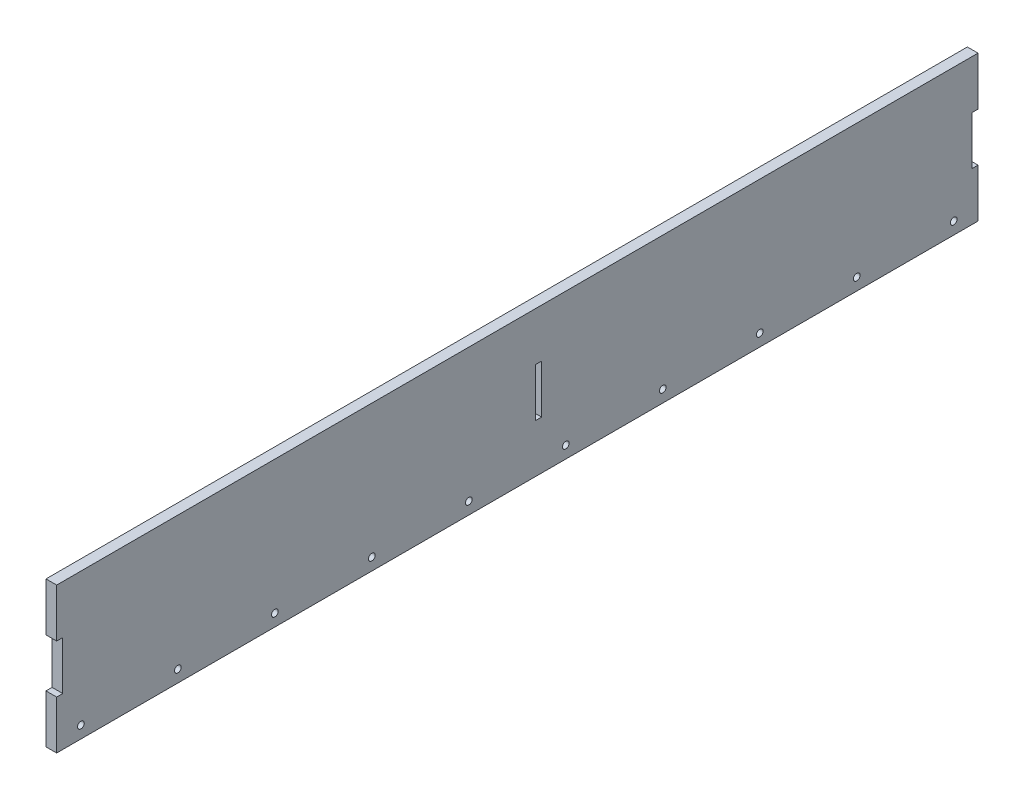
ISO-10303-21;
HEADER;
FILE_DESCRIPTION(('STEP AP214'),'2;1');
FILE_NAME('part.step','',(''),(''),'','','');
FILE_SCHEMA(('AUTOMOTIVE_DESIGN { 1 0 10303 214 1 1 1 1 }'));
ENDSEC;
DATA;
#1=APPLICATION_CONTEXT('core data for automotive mechanical design processes');
#2=APPLICATION_PROTOCOL_DEFINITION('international standard','automotive_design',2000,#1);
#3=PRODUCT_CONTEXT('',#1,'mechanical');
#4=PRODUCT('Part','Part','',(#3));
#5=PRODUCT_RELATED_PRODUCT_CATEGORY('part','',(#4));
#6=PRODUCT_DEFINITION_FORMATION('','',#4);
#7=PRODUCT_DEFINITION_CONTEXT('part definition',#1,'design');
#8=PRODUCT_DEFINITION('design','',#6,#7);
#9=PRODUCT_DEFINITION_SHAPE('','',#8);
#10=(LENGTH_UNIT() NAMED_UNIT(*) SI_UNIT(.MILLI.,.METRE.));
#11=(NAMED_UNIT(*) PLANE_ANGLE_UNIT() SI_UNIT($,.RADIAN.));
#12=(NAMED_UNIT(*) SI_UNIT($,.STERADIAN.) SOLID_ANGLE_UNIT());
#13=UNCERTAINTY_MEASURE_WITH_UNIT(LENGTH_MEASURE(1.E-05),#10,'distance_accuracy_value','');
#14=(GEOMETRIC_REPRESENTATION_CONTEXT(3) GLOBAL_UNCERTAINTY_ASSIGNED_CONTEXT((#13)) GLOBAL_UNIT_ASSIGNED_CONTEXT((#10,
#11,#12)) REPRESENTATION_CONTEXT('',''));
#15=CARTESIAN_POINT('',(0.,0.,0.));
#16=DIRECTION('',(0.,0.,1.));
#17=DIRECTION('',(1.,0.,0.));
#18=AXIS2_PLACEMENT_3D('',#15,#16,#17);
#19=CARTESIAN_POINT('',(-88.9,0.,0.));
#20=DIRECTION('',(-1.,0.,0.));
#21=DIRECTION('',(0.,0.,1.));
#22=AXIS2_PLACEMENT_3D('',#19,#20,#21);
#23=PLANE('',#22);
#24=CARTESIAN_POINT('',(-88.9,-130.175,-209.55));
#25=DIRECTION('',(-1.,0.,0.));
#26=DIRECTION('',(0.,0.,1.));
#27=AXIS2_PLACEMENT_3D('',#24,#25,#26);
#28=CIRCLE('',#27,1.7526);
#29=CARTESIAN_POINT('',(-88.9,-130.175,-207.7974));
#30=VERTEX_POINT('',#29);
#31=EDGE_CURVE('E175',#30,#30,#28,.T.);
#32=ORIENTED_EDGE('',*,*,#31,.T.);
#33=EDGE_LOOP('',(#32));
#34=FACE_BOUND('',#33,.T.);
#35=CARTESIAN_POINT('',(-88.9,-130.175,-260.35));
#36=DIRECTION('',(-1.,0.,0.));
#37=DIRECTION('',(0.,0.,1.));
#38=AXIS2_PLACEMENT_3D('',#35,#36,#37);
#39=CIRCLE('',#38,1.75260000000004);
#40=CARTESIAN_POINT('',(-88.9,-130.175,-258.5974));
#41=VERTEX_POINT('',#40);
#42=EDGE_CURVE('E299',#41,#41,#39,.T.);
#43=ORIENTED_EDGE('',*,*,#42,.T.);
#44=EDGE_LOOP('',(#43));
#45=FACE_BOUND('',#44,.T.);
#46=CARTESIAN_POINT('',(-88.9,-130.175,-311.15));
#47=DIRECTION('',(-1.,0.,0.));
#48=DIRECTION('',(0.,0.,1.));
#49=AXIS2_PLACEMENT_3D('',#46,#47,#48);
#50=CIRCLE('',#49,1.75259999999998);
#51=CARTESIAN_POINT('',(-88.9,-130.175,-309.3974));
#52=VERTEX_POINT('',#51);
#53=EDGE_CURVE('E296',#52,#52,#50,.T.);
#54=ORIENTED_EDGE('',*,*,#53,.T.);
#55=EDGE_LOOP('',(#54));
#56=FACE_BOUND('',#55,.T.);
#57=CARTESIAN_POINT('',(-88.9,-130.175,-361.95));
#58=DIRECTION('',(-1.,0.,0.));
#59=DIRECTION('',(0.,0.,1.));
#60=AXIS2_PLACEMENT_3D('',#57,#58,#59);
#61=CIRCLE('',#60,1.75259999999998);
#62=CARTESIAN_POINT('',(-88.9,-130.175,-360.1974));
#63=VERTEX_POINT('',#62);
#64=EDGE_CURVE('E293',#63,#63,#61,.T.);
#65=ORIENTED_EDGE('',*,*,#64,.T.);
#66=EDGE_LOOP('',(#65));
#67=FACE_BOUND('',#66,.T.);
#68=CARTESIAN_POINT('',(-88.9,-130.175,-412.75));
#69=DIRECTION('',(-1.,0.,0.));
#70=DIRECTION('',(0.,0.,1.));
#71=AXIS2_PLACEMENT_3D('',#68,#69,#70);
#72=CIRCLE('',#71,1.75260000000004);
#73=CARTESIAN_POINT('',(-88.9,-130.175,-410.9974));
#74=VERTEX_POINT('',#73);
#75=EDGE_CURVE('E289',#74,#74,#72,.T.);
#76=ORIENTED_EDGE('',*,*,#75,.T.);
#77=EDGE_LOOP('',(#76));
#78=FACE_BOUND('',#77,.T.);
#79=CARTESIAN_POINT('',(-88.9,-130.175,-463.55));
#80=DIRECTION('',(-1.,0.,0.));
#81=DIRECTION('',(0.,0.,1.));
#82=AXIS2_PLACEMENT_3D('',#79,#80,#81);
#83=CIRCLE('',#82,1.75259999999998);
#84=CARTESIAN_POINT('',(-88.9,-130.175,-461.7974));
#85=VERTEX_POINT('',#84);
#86=EDGE_CURVE('E285',#85,#85,#83,.T.);
#87=ORIENTED_EDGE('',*,*,#86,.T.);
#88=EDGE_LOOP('',(#87));
#89=FACE_BOUND('',#88,.T.);
#90=CARTESIAN_POINT('',(-88.9,-130.175,-514.35));
#91=DIRECTION('',(-1.,0.,0.));
#92=DIRECTION('',(0.,0.,1.));
#93=AXIS2_PLACEMENT_3D('',#90,#91,#92);
#94=CIRCLE('',#93,1.75260000000003);
#95=CARTESIAN_POINT('',(-88.9,-130.175,-512.5974));
#96=VERTEX_POINT('',#95);
#97=EDGE_CURVE('E281',#96,#96,#94,.T.);
#98=ORIENTED_EDGE('',*,*,#97,.T.);
#99=EDGE_LOOP('',(#98));
#100=FACE_BOUND('',#99,.T.);
#101=CARTESIAN_POINT('',(-88.9,-130.175,-565.15));
#102=DIRECTION('',(-1.,0.,0.));
#103=DIRECTION('',(0.,0.,1.));
#104=AXIS2_PLACEMENT_3D('',#101,#102,#103);
#105=CIRCLE('',#104,1.75260000000003);
#106=CARTESIAN_POINT('',(-88.9,-130.175,-563.3974));
#107=VERTEX_POINT('',#106);
#108=EDGE_CURVE('E277',#107,#107,#105,.T.);
#109=ORIENTED_EDGE('',*,*,#108,.T.);
#110=EDGE_LOOP('',(#109));
#111=FACE_BOUND('',#110,.T.);
#112=CARTESIAN_POINT('',(-88.9,-130.175,-615.95));
#113=DIRECTION('',(-1.,0.,0.));
#114=DIRECTION('',(0.,0.,1.));
#115=AXIS2_PLACEMENT_3D('',#112,#113,#114);
#116=CIRCLE('',#115,1.75259999999991);
#117=CARTESIAN_POINT('',(-88.9,-130.175,-614.1974));
#118=VERTEX_POINT('',#117);
#119=EDGE_CURVE('E273',#118,#118,#116,.T.);
#120=ORIENTED_EDGE('',*,*,#119,.T.);
#121=EDGE_LOOP('',(#120));
#122=FACE_BOUND('',#121,.T.);
#123=CARTESIAN_POINT('',(-88.9,-130.175,-666.75));
#124=DIRECTION('',(-1.,0.,0.));
#125=DIRECTION('',(0.,0.,1.));
#126=AXIS2_PLACEMENT_3D('',#123,#124,#125);
#127=CIRCLE('',#126,1.75260000000003);
#128=CARTESIAN_POINT('',(-88.9,-130.175,-664.9974));
#129=VERTEX_POINT('',#128);
#130=EDGE_CURVE('E269',#129,#129,#127,.T.);
#131=ORIENTED_EDGE('',*,*,#130,.T.);
#132=EDGE_LOOP('',(#131));
#133=FACE_BOUND('',#132,.T.);
#134=DIRECTION('',(0.,-1.,0.));
#135=VECTOR('',#134,1.);
#136=CARTESIAN_POINT('',(-88.9,-85.7250000000001,-196.85));
#137=LINE('',#136,#135);
#138=CARTESIAN_POINT('',(-88.9,-60.325,-196.85));
#139=VERTEX_POINT('',#138);
#140=CARTESIAN_POINT('',(-88.9,-85.7250000000001,-196.85));
#141=VERTEX_POINT('',#140);
#142=EDGE_CURVE('E185',#139,#141,#137,.T.);
#143=ORIENTED_EDGE('',*,*,#142,.T.);
#144=DIRECTION('',(0.,0.,-1.));
#145=VECTOR('',#144,1.);
#146=CARTESIAN_POINT('',(-88.9,-85.7250000000001,-200.025));
#147=LINE('',#146,#145);
#148=CARTESIAN_POINT('',(-88.9,-85.7250000000001,-200.025));
#149=VERTEX_POINT('',#148);
#150=EDGE_CURVE('E188',#141,#149,#147,.T.);
#151=ORIENTED_EDGE('',*,*,#150,.T.);
#152=DIRECTION('',(0.,-1.,0.));
#153=VECTOR('',#152,1.);
#154=CARTESIAN_POINT('',(-88.9,-111.125,-200.025));
#155=LINE('',#154,#153);
#156=CARTESIAN_POINT('',(-88.9,-111.125,-200.025));
#157=VERTEX_POINT('',#156);
#158=EDGE_CURVE('E191',#149,#157,#155,.T.);
#159=ORIENTED_EDGE('',*,*,#158,.T.);
#160=DIRECTION('',(0.,0.,1.));
#161=VECTOR('',#160,1.);
#162=CARTESIAN_POINT('',(-88.9,-111.125,-196.85));
#163=LINE('',#162,#161);
#164=CARTESIAN_POINT('',(-88.9,-111.125,-196.85));
#165=VERTEX_POINT('',#164);
#166=EDGE_CURVE('E193',#157,#165,#163,.T.);
#167=ORIENTED_EDGE('',*,*,#166,.T.);
#168=DIRECTION('',(0.,-1.,0.));
#169=VECTOR('',#168,1.);
#170=CARTESIAN_POINT('',(-88.9,-111.125,-196.85));
#171=LINE('',#170,#169);
#172=CARTESIAN_POINT('',(-88.9,-136.525,-196.85));
#173=VERTEX_POINT('',#172);
#174=EDGE_CURVE('E195',#165,#173,#171,.T.);
#175=ORIENTED_EDGE('',*,*,#174,.T.);
#176=DIRECTION('',(0.,0.,-1.));
#177=VECTOR('',#176,1.);
#178=CARTESIAN_POINT('',(-88.9,-136.525,-196.85));
#179=LINE('',#178,#177);
#180=CARTESIAN_POINT('',(-88.9,-136.525,-679.45));
#181=VERTEX_POINT('',#180);
#182=EDGE_CURVE('E197',#173,#181,#179,.T.);
#183=ORIENTED_EDGE('',*,*,#182,.T.);
#184=DIRECTION('',(0.,1.,0.));
#185=VECTOR('',#184,1.);
#186=CARTESIAN_POINT('',(-88.9,-136.525,-679.45));
#187=LINE('',#186,#185);
#188=CARTESIAN_POINT('',(-88.9,-111.125,-679.45));
#189=VERTEX_POINT('',#188);
#190=EDGE_CURVE('E199',#181,#189,#187,.T.);
#191=ORIENTED_EDGE('',*,*,#190,.T.);
#192=DIRECTION('',(0.,0.,1.));
#193=VECTOR('',#192,1.);
#194=CARTESIAN_POINT('',(-88.9,-111.125,-676.275));
#195=LINE('',#194,#193);
#196=CARTESIAN_POINT('',(-88.9,-111.125,-676.275));
#197=VERTEX_POINT('',#196);
#198=EDGE_CURVE('E201',#189,#197,#195,.T.);
#199=ORIENTED_EDGE('',*,*,#198,.T.);
#200=DIRECTION('',(0.,1.,0.));
#201=VECTOR('',#200,1.);
#202=CARTESIAN_POINT('',(-88.9,-85.7250000000001,-676.275));
#203=LINE('',#202,#201);
#204=CARTESIAN_POINT('',(-88.9,-85.7250000000001,-676.275));
#205=VERTEX_POINT('',#204);
#206=EDGE_CURVE('E203',#197,#205,#203,.T.);
#207=ORIENTED_EDGE('',*,*,#206,.T.);
#208=DIRECTION('',(0.,0.,-1.));
#209=VECTOR('',#208,1.);
#210=CARTESIAN_POINT('',(-88.9,-85.7250000000001,-679.45));
#211=LINE('',#210,#209);
#212=CARTESIAN_POINT('',(-88.9,-85.7250000000001,-679.45));
#213=VERTEX_POINT('',#212);
#214=EDGE_CURVE('E205',#205,#213,#211,.T.);
#215=ORIENTED_EDGE('',*,*,#214,.T.);
#216=DIRECTION('',(0.,1.,0.));
#217=VECTOR('',#216,1.);
#218=CARTESIAN_POINT('',(-88.9,-60.325,-679.45));
#219=LINE('',#218,#217);
#220=CARTESIAN_POINT('',(-88.9,-60.325,-679.45));
#221=VERTEX_POINT('',#220);
#222=EDGE_CURVE('E207',#213,#221,#219,.T.);
#223=ORIENTED_EDGE('',*,*,#222,.T.);
#224=DIRECTION('',(0.,0.,1.));
#225=VECTOR('',#224,1.);
#226=CARTESIAN_POINT('',(-88.9,-60.325,-196.85));
#227=LINE('',#226,#225);
#228=EDGE_CURVE('E209',#221,#139,#227,.T.);
#229=ORIENTED_EDGE('',*,*,#228,.T.);
#230=EDGE_LOOP('',(#143,#151,#159,#167,#175,#183,#191,#199,#207,#215,#223,#229));
#231=FACE_BOUND('',#230,.T.);
#232=DIRECTION('',(0.,0.,-1.));
#233=VECTOR('',#232,1.);
#234=CARTESIAN_POINT('',(-88.9,-111.125,-447.675));
#235=LINE('',#234,#233);
#236=CARTESIAN_POINT('',(-88.9,-111.125,-447.675));
#237=VERTEX_POINT('',#236);
#238=CARTESIAN_POINT('',(-88.9,-111.125,-450.85));
#239=VERTEX_POINT('',#238);
#240=EDGE_CURVE('E147',#237,#239,#235,.T.);
#241=ORIENTED_EDGE('',*,*,#240,.F.);
#242=DIRECTION('',(0.,-1.,0.));
#243=VECTOR('',#242,1.);
#244=CARTESIAN_POINT('',(-88.9,-85.725,-447.675));
#245=LINE('',#244,#243);
#246=CARTESIAN_POINT('',(-88.9,-85.725,-447.675));
#247=VERTEX_POINT('',#246);
#248=EDGE_CURVE('E169',#247,#237,#245,.T.);
#249=ORIENTED_EDGE('',*,*,#248,.F.);
#250=DIRECTION('',(0.,0.,1.));
#251=VECTOR('',#250,1.);
#252=CARTESIAN_POINT('',(-88.9,-85.725,-450.85));
#253=LINE('',#252,#251);
#254=CARTESIAN_POINT('',(-88.9,-85.725,-450.85));
#255=VERTEX_POINT('',#254);
#256=EDGE_CURVE('E167',#255,#247,#253,.T.);
#257=ORIENTED_EDGE('',*,*,#256,.F.);
#258=DIRECTION('',(0.,1.,0.));
#259=VECTOR('',#258,1.);
#260=CARTESIAN_POINT('',(-88.9,-111.125,-450.85));
#261=LINE('',#260,#259);
#262=EDGE_CURVE('E155',#239,#255,#261,.T.);
#263=ORIENTED_EDGE('',*,*,#262,.F.);
#264=EDGE_LOOP('',(#241,#249,#257,#263));
#265=FACE_BOUND('',#264,.T.);
#266=ADVANCED_FACE('F32',(#34,#45,#56,#67,#78,#89,#100,#111,#122,#133,#231,#265),#23,.F.);
#267=CARTESIAN_POINT('',(-94.488,0.,0.));
#268=DIRECTION('',(-1.,0.,0.));
#269=DIRECTION('',(0.,0.,1.));
#270=AXIS2_PLACEMENT_3D('',#267,#268,#269);
#271=PLANE('',#270);
#272=CARTESIAN_POINT('',(-94.488,-130.175,-209.55));
#273=DIRECTION('',(-1.,0.,0.));
#274=DIRECTION('',(0.,0.,1.));
#275=AXIS2_PLACEMENT_3D('',#272,#273,#274);
#276=CIRCLE('',#275,1.7526);
#277=CARTESIAN_POINT('',(-94.488,-130.175,-207.7974));
#278=VERTEX_POINT('',#277);
#279=EDGE_CURVE('E36',#278,#278,#276,.T.);
#280=ORIENTED_EDGE('',*,*,#279,.F.);
#281=EDGE_LOOP('',(#280));
#282=FACE_BOUND('',#281,.T.);
#283=CARTESIAN_POINT('',(-94.488,-130.175,-260.35));
#284=DIRECTION('',(-1.,0.,0.));
#285=DIRECTION('',(0.,0.,1.));
#286=AXIS2_PLACEMENT_3D('',#283,#284,#285);
#287=CIRCLE('',#286,1.75260000000004);
#288=CARTESIAN_POINT('',(-94.488,-130.175,-258.5974));
#289=VERTEX_POINT('',#288);
#290=EDGE_CURVE('E297',#289,#289,#287,.T.);
#291=ORIENTED_EDGE('',*,*,#290,.F.);
#292=EDGE_LOOP('',(#291));
#293=FACE_BOUND('',#292,.T.);
#294=CARTESIAN_POINT('',(-94.488,-130.175,-311.15));
#295=DIRECTION('',(-1.,0.,0.));
#296=DIRECTION('',(0.,0.,1.));
#297=AXIS2_PLACEMENT_3D('',#294,#295,#296);
#298=CIRCLE('',#297,1.75259999999998);
#299=CARTESIAN_POINT('',(-94.488,-130.175,-309.3974));
#300=VERTEX_POINT('',#299);
#301=EDGE_CURVE('E294',#300,#300,#298,.T.);
#302=ORIENTED_EDGE('',*,*,#301,.F.);
#303=EDGE_LOOP('',(#302));
#304=FACE_BOUND('',#303,.T.);
#305=CARTESIAN_POINT('',(-94.488,-130.175,-361.95));
#306=DIRECTION('',(-1.,0.,0.));
#307=DIRECTION('',(0.,0.,1.));
#308=AXIS2_PLACEMENT_3D('',#305,#306,#307);
#309=CIRCLE('',#308,1.75259999999998);
#310=CARTESIAN_POINT('',(-94.488,-130.175,-360.1974));
#311=VERTEX_POINT('',#310);
#312=EDGE_CURVE('E290',#311,#311,#309,.T.);
#313=ORIENTED_EDGE('',*,*,#312,.F.);
#314=EDGE_LOOP('',(#313));
#315=FACE_BOUND('',#314,.T.);
#316=CARTESIAN_POINT('',(-94.488,-130.175,-412.75));
#317=DIRECTION('',(-1.,0.,0.));
#318=DIRECTION('',(0.,0.,1.));
#319=AXIS2_PLACEMENT_3D('',#316,#317,#318);
#320=CIRCLE('',#319,1.75260000000004);
#321=CARTESIAN_POINT('',(-94.488,-130.175,-410.9974));
#322=VERTEX_POINT('',#321);
#323=EDGE_CURVE('E286',#322,#322,#320,.T.);
#324=ORIENTED_EDGE('',*,*,#323,.F.);
#325=EDGE_LOOP('',(#324));
#326=FACE_BOUND('',#325,.T.);
#327=CARTESIAN_POINT('',(-94.488,-130.175,-463.55));
#328=DIRECTION('',(-1.,0.,0.));
#329=DIRECTION('',(0.,0.,1.));
#330=AXIS2_PLACEMENT_3D('',#327,#328,#329);
#331=CIRCLE('',#330,1.75259999999998);
#332=CARTESIAN_POINT('',(-94.488,-130.175,-461.7974));
#333=VERTEX_POINT('',#332);
#334=EDGE_CURVE('E282',#333,#333,#331,.T.);
#335=ORIENTED_EDGE('',*,*,#334,.F.);
#336=EDGE_LOOP('',(#335));
#337=FACE_BOUND('',#336,.T.);
#338=CARTESIAN_POINT('',(-94.488,-130.175,-514.35));
#339=DIRECTION('',(-1.,0.,0.));
#340=DIRECTION('',(0.,0.,1.));
#341=AXIS2_PLACEMENT_3D('',#338,#339,#340);
#342=CIRCLE('',#341,1.75260000000003);
#343=CARTESIAN_POINT('',(-94.488,-130.175,-512.5974));
#344=VERTEX_POINT('',#343);
#345=EDGE_CURVE('E278',#344,#344,#342,.T.);
#346=ORIENTED_EDGE('',*,*,#345,.F.);
#347=EDGE_LOOP('',(#346));
#348=FACE_BOUND('',#347,.T.);
#349=CARTESIAN_POINT('',(-94.488,-130.175,-565.15));
#350=DIRECTION('',(-1.,0.,0.));
#351=DIRECTION('',(0.,0.,1.));
#352=AXIS2_PLACEMENT_3D('',#349,#350,#351);
#353=CIRCLE('',#352,1.75260000000003);
#354=CARTESIAN_POINT('',(-94.488,-130.175,-563.3974));
#355=VERTEX_POINT('',#354);
#356=EDGE_CURVE('E274',#355,#355,#353,.T.);
#357=ORIENTED_EDGE('',*,*,#356,.F.);
#358=EDGE_LOOP('',(#357));
#359=FACE_BOUND('',#358,.T.);
#360=CARTESIAN_POINT('',(-94.488,-130.175,-615.95));
#361=DIRECTION('',(-1.,0.,0.));
#362=DIRECTION('',(0.,0.,1.));
#363=AXIS2_PLACEMENT_3D('',#360,#361,#362);
#364=CIRCLE('',#363,1.75259999999991);
#365=CARTESIAN_POINT('',(-94.488,-130.175,-614.1974));
#366=VERTEX_POINT('',#365);
#367=EDGE_CURVE('E270',#366,#366,#364,.T.);
#368=ORIENTED_EDGE('',*,*,#367,.F.);
#369=EDGE_LOOP('',(#368));
#370=FACE_BOUND('',#369,.T.);
#371=CARTESIAN_POINT('',(-94.488,-130.175,-666.75));
#372=DIRECTION('',(-1.,0.,0.));
#373=DIRECTION('',(0.,0.,1.));
#374=AXIS2_PLACEMENT_3D('',#371,#372,#373);
#375=CIRCLE('',#374,1.75260000000003);
#376=CARTESIAN_POINT('',(-94.488,-130.175,-664.9974));
#377=VERTEX_POINT('',#376);
#378=EDGE_CURVE('E266',#377,#377,#375,.T.);
#379=ORIENTED_EDGE('',*,*,#378,.F.);
#380=EDGE_LOOP('',(#379));
#381=FACE_BOUND('',#380,.T.);
#382=DIRECTION('',(0.,-1.,0.));
#383=VECTOR('',#382,1.);
#384=CARTESIAN_POINT('',(-94.488,-85.7250000000001,-196.85));
#385=LINE('',#384,#383);
#386=CARTESIAN_POINT('',(-94.488,-60.325,-196.85));
#387=VERTEX_POINT('',#386);
#388=CARTESIAN_POINT('',(-94.488,-85.7250000000001,-196.85));
#389=VERTEX_POINT('',#388);
#390=EDGE_CURVE('E163',#387,#389,#385,.T.);
#391=ORIENTED_EDGE('',*,*,#390,.F.);
#392=DIRECTION('',(0.,0.,1.));
#393=VECTOR('',#392,1.);
#394=CARTESIAN_POINT('',(-94.488,-60.325,-196.85));
#395=LINE('',#394,#393);
#396=CARTESIAN_POINT('',(-94.488,-60.325,-679.45));
#397=VERTEX_POINT('',#396);
#398=EDGE_CURVE('E189',#397,#387,#395,.T.);
#399=ORIENTED_EDGE('',*,*,#398,.F.);
#400=DIRECTION('',(0.,1.,0.));
#401=VECTOR('',#400,1.);
#402=CARTESIAN_POINT('',(-94.488,-60.325,-679.45));
#403=LINE('',#402,#401);
#404=CARTESIAN_POINT('',(-94.488,-85.7250000000001,-679.45));
#405=VERTEX_POINT('',#404);
#406=EDGE_CURVE('E232',#405,#397,#403,.T.);
#407=ORIENTED_EDGE('',*,*,#406,.F.);
#408=DIRECTION('',(0.,0.,-1.));
#409=VECTOR('',#408,1.);
#410=CARTESIAN_POINT('',(-94.488,-85.7250000000001,-679.45));
#411=LINE('',#410,#409);
#412=CARTESIAN_POINT('',(-94.488,-85.7250000000001,-676.275));
#413=VERTEX_POINT('',#412);
#414=EDGE_CURVE('E230',#413,#405,#411,.T.);
#415=ORIENTED_EDGE('',*,*,#414,.F.);
#416=DIRECTION('',(0.,1.,0.));
#417=VECTOR('',#416,1.);
#418=CARTESIAN_POINT('',(-94.488,-85.7250000000001,-676.275));
#419=LINE('',#418,#417);
#420=CARTESIAN_POINT('',(-94.488,-111.125,-676.275));
#421=VERTEX_POINT('',#420);
#422=EDGE_CURVE('E228',#421,#413,#419,.T.);
#423=ORIENTED_EDGE('',*,*,#422,.F.);
#424=DIRECTION('',(0.,0.,1.));
#425=VECTOR('',#424,1.);
#426=CARTESIAN_POINT('',(-94.488,-111.125,-676.275));
#427=LINE('',#426,#425);
#428=CARTESIAN_POINT('',(-94.488,-111.125,-679.45));
#429=VERTEX_POINT('',#428);
#430=EDGE_CURVE('E226',#429,#421,#427,.T.);
#431=ORIENTED_EDGE('',*,*,#430,.F.);
#432=DIRECTION('',(0.,1.,0.));
#433=VECTOR('',#432,1.);
#434=CARTESIAN_POINT('',(-94.488,-136.525,-679.45));
#435=LINE('',#434,#433);
#436=CARTESIAN_POINT('',(-94.488,-136.525,-679.45));
#437=VERTEX_POINT('',#436);
#438=EDGE_CURVE('E224',#437,#429,#435,.T.);
#439=ORIENTED_EDGE('',*,*,#438,.F.);
#440=DIRECTION('',(0.,0.,-1.));
#441=VECTOR('',#440,1.);
#442=CARTESIAN_POINT('',(-94.488,-136.525,-196.85));
#443=LINE('',#442,#441);
#444=CARTESIAN_POINT('',(-94.488,-136.525,-196.85));
#445=VERTEX_POINT('',#444);
#446=EDGE_CURVE('E222',#445,#437,#443,.T.);
#447=ORIENTED_EDGE('',*,*,#446,.F.);
#448=DIRECTION('',(0.,-1.,0.));
#449=VECTOR('',#448,1.);
#450=CARTESIAN_POINT('',(-94.488,-111.125,-196.85));
#451=LINE('',#450,#449);
#452=CARTESIAN_POINT('',(-94.488,-111.125,-196.85));
#453=VERTEX_POINT('',#452);
#454=EDGE_CURVE('E220',#453,#445,#451,.T.);
#455=ORIENTED_EDGE('',*,*,#454,.F.);
#456=DIRECTION('',(0.,0.,1.));
#457=VECTOR('',#456,1.);
#458=CARTESIAN_POINT('',(-94.488,-111.125,-196.85));
#459=LINE('',#458,#457);
#460=CARTESIAN_POINT('',(-94.488,-111.125,-200.025));
#461=VERTEX_POINT('',#460);
#462=EDGE_CURVE('E218',#461,#453,#459,.T.);
#463=ORIENTED_EDGE('',*,*,#462,.F.);
#464=DIRECTION('',(0.,-1.,0.));
#465=VECTOR('',#464,1.);
#466=CARTESIAN_POINT('',(-94.488,-111.125,-200.025));
#467=LINE('',#466,#465);
#468=CARTESIAN_POINT('',(-94.488,-85.7250000000001,-200.025));
#469=VERTEX_POINT('',#468);
#470=EDGE_CURVE('E216',#469,#461,#467,.T.);
#471=ORIENTED_EDGE('',*,*,#470,.F.);
#472=DIRECTION('',(0.,0.,-1.));
#473=VECTOR('',#472,1.);
#474=CARTESIAN_POINT('',(-94.488,-85.7250000000001,-200.025));
#475=LINE('',#474,#473);
#476=EDGE_CURVE('E214',#389,#469,#475,.T.);
#477=ORIENTED_EDGE('',*,*,#476,.F.);
#478=EDGE_LOOP('',(#391,#399,#407,#415,#423,#431,#439,#447,#455,#463,#471,#477));
#479=FACE_BOUND('',#478,.T.);
#480=DIRECTION('',(0.,-1.,0.));
#481=VECTOR('',#480,1.);
#482=CARTESIAN_POINT('',(-94.488,-85.725,-447.675));
#483=LINE('',#482,#481);
#484=CARTESIAN_POINT('',(-94.488,-85.725,-447.675));
#485=VERTEX_POINT('',#484);
#486=CARTESIAN_POINT('',(-94.488,-111.125,-447.675));
#487=VERTEX_POINT('',#486);
#488=EDGE_CURVE('E156',#485,#487,#483,.T.);
#489=ORIENTED_EDGE('',*,*,#488,.T.);
#490=DIRECTION('',(0.,0.,-1.));
#491=VECTOR('',#490,1.);
#492=CARTESIAN_POINT('',(-94.488,-111.125,-447.675));
#493=LINE('',#492,#491);
#494=CARTESIAN_POINT('',(-94.488,-111.125,-450.85));
#495=VERTEX_POINT('',#494);
#496=EDGE_CURVE('E57',#487,#495,#493,.T.);
#497=ORIENTED_EDGE('',*,*,#496,.T.);
#498=DIRECTION('',(0.,1.,0.));
#499=VECTOR('',#498,1.);
#500=CARTESIAN_POINT('',(-94.488,-111.125,-450.85));
#501=LINE('',#500,#499);
#502=CARTESIAN_POINT('',(-94.488,-85.725,-450.85));
#503=VERTEX_POINT('',#502);
#504=EDGE_CURVE('E162',#495,#503,#501,.T.);
#505=ORIENTED_EDGE('',*,*,#504,.T.);
#506=DIRECTION('',(0.,0.,1.));
#507=VECTOR('',#506,1.);
#508=CARTESIAN_POINT('',(-94.488,-85.725,-450.85));
#509=LINE('',#508,#507);
#510=EDGE_CURVE('E177',#503,#485,#509,.T.);
#511=ORIENTED_EDGE('',*,*,#510,.T.);
#512=EDGE_LOOP('',(#489,#497,#505,#511));
#513=FACE_BOUND('',#512,.T.);
#514=ADVANCED_FACE('F319',(#282,#293,#304,#315,#326,#337,#348,#359,#370,#381,#479,#513),#271,.T.);
#515=CARTESIAN_POINT('',(-88.9,-85.7250000000001,-196.85));
#516=DIRECTION('',(0.,0.,-1.));
#517=DIRECTION('',(0.,1.,0.));
#518=AXIS2_PLACEMENT_3D('',#515,#516,#517);
#519=PLANE('',#518);
#520=ORIENTED_EDGE('',*,*,#390,.T.);
#521=DIRECTION('',(-1.,0.,0.));
#522=VECTOR('',#521,1.);
#523=CARTESIAN_POINT('',(-88.9,-85.7250000000001,-196.85));
#524=LINE('',#523,#522);
#525=EDGE_CURVE('E11',#141,#389,#524,.T.);
#526=ORIENTED_EDGE('',*,*,#525,.F.);
#527=ORIENTED_EDGE('',*,*,#142,.F.);
#528=DIRECTION('',(-1.,0.,0.));
#529=VECTOR('',#528,1.);
#530=CARTESIAN_POINT('',(-88.9,-60.325,-196.85));
#531=LINE('',#530,#529);
#532=EDGE_CURVE('E211',#139,#387,#531,.T.);
#533=ORIENTED_EDGE('',*,*,#532,.T.);
#534=EDGE_LOOP('',(#520,#526,#527,#533));
#535=FACE_BOUND('',#534,.T.);
#536=ADVANCED_FACE('F34',(#535),#519,.F.);
#537=CARTESIAN_POINT('',(-88.9,-85.7250000000001,-200.025));
#538=DIRECTION('',(0.,1.,0.));
#539=DIRECTION('',(0.,0.,1.));
#540=AXIS2_PLACEMENT_3D('',#537,#538,#539);
#541=PLANE('',#540);
#542=ORIENTED_EDGE('',*,*,#476,.T.);
#543=DIRECTION('',(-1.,0.,0.));
#544=VECTOR('',#543,1.);
#545=CARTESIAN_POINT('',(-88.9,-85.7250000000001,-200.025));
#546=LINE('',#545,#544);
#547=EDGE_CURVE('E41',#149,#469,#546,.T.);
#548=ORIENTED_EDGE('',*,*,#547,.F.);
#549=ORIENTED_EDGE('',*,*,#150,.F.);
#550=ORIENTED_EDGE('',*,*,#525,.T.);
#551=EDGE_LOOP('',(#542,#548,#549,#550));
#552=FACE_BOUND('',#551,.T.);
#553=ADVANCED_FACE('F404',(#552),#541,.F.);
#554=CARTESIAN_POINT('',(-88.9,-111.125,-200.025));
#555=DIRECTION('',(0.,0.,-1.));
#556=DIRECTION('',(-1.,0.,0.));
#557=AXIS2_PLACEMENT_3D('',#554,#555,#556);
#558=PLANE('',#557);
#559=ORIENTED_EDGE('',*,*,#470,.T.);
#560=DIRECTION('',(-1.,0.,0.));
#561=VECTOR('',#560,1.);
#562=CARTESIAN_POINT('',(-88.9,-111.125,-200.025));
#563=LINE('',#562,#561);
#564=EDGE_CURVE('E261',#157,#461,#563,.T.);
#565=ORIENTED_EDGE('',*,*,#564,.F.);
#566=ORIENTED_EDGE('',*,*,#158,.F.);
#567=ORIENTED_EDGE('',*,*,#547,.T.);
#568=EDGE_LOOP('',(#559,#565,#566,#567));
#569=FACE_BOUND('',#568,.T.);
#570=ADVANCED_FACE('F401',(#569),#558,.F.);
#571=CARTESIAN_POINT('',(-88.9,-111.125,-196.85));
#572=DIRECTION('',(0.,-1.,0.));
#573=DIRECTION('',(0.,0.,-1.));
#574=AXIS2_PLACEMENT_3D('',#571,#572,#573);
#575=PLANE('',#574);
#576=ORIENTED_EDGE('',*,*,#462,.T.);
#577=DIRECTION('',(-1.,0.,0.));
#578=VECTOR('',#577,1.);
#579=CARTESIAN_POINT('',(-88.9,-111.125,-196.85));
#580=LINE('',#579,#578);
#581=EDGE_CURVE('E258',#165,#453,#580,.T.);
#582=ORIENTED_EDGE('',*,*,#581,.F.);
#583=ORIENTED_EDGE('',*,*,#166,.F.);
#584=ORIENTED_EDGE('',*,*,#564,.T.);
#585=EDGE_LOOP('',(#576,#582,#583,#584));
#586=FACE_BOUND('',#585,.T.);
#587=ADVANCED_FACE('F397',(#586),#575,.F.);
#588=CARTESIAN_POINT('',(-88.9,-111.125,-196.85));
#589=DIRECTION('',(0.,0.,-1.));
#590=DIRECTION('',(0.,1.,0.));
#591=AXIS2_PLACEMENT_3D('',#588,#589,#590);
#592=PLANE('',#591);
#593=ORIENTED_EDGE('',*,*,#454,.T.);
#594=DIRECTION('',(-1.,0.,0.));
#595=VECTOR('',#594,1.);
#596=CARTESIAN_POINT('',(-88.9,-136.525,-196.85));
#597=LINE('',#596,#595);
#598=EDGE_CURVE('E255',#173,#445,#597,.T.);
#599=ORIENTED_EDGE('',*,*,#598,.F.);
#600=ORIENTED_EDGE('',*,*,#174,.F.);
#601=ORIENTED_EDGE('',*,*,#581,.T.);
#602=EDGE_LOOP('',(#593,#599,#600,#601));
#603=FACE_BOUND('',#602,.T.);
#604=ADVANCED_FACE('F393',(#603),#592,.F.);
#605=CARTESIAN_POINT('',(-88.9,-136.525,-196.85));
#606=DIRECTION('',(0.,1.,0.));
#607=DIRECTION('',(0.,0.,1.));
#608=AXIS2_PLACEMENT_3D('',#605,#606,#607);
#609=PLANE('',#608);
#610=ORIENTED_EDGE('',*,*,#446,.T.);
#611=DIRECTION('',(-1.,0.,0.));
#612=VECTOR('',#611,1.);
#613=CARTESIAN_POINT('',(-88.9,-136.525,-679.45));
#614=LINE('',#613,#612);
#615=EDGE_CURVE('E252',#181,#437,#614,.T.);
#616=ORIENTED_EDGE('',*,*,#615,.F.);
#617=ORIENTED_EDGE('',*,*,#182,.F.);
#618=ORIENTED_EDGE('',*,*,#598,.T.);
#619=EDGE_LOOP('',(#610,#616,#617,#618));
#620=FACE_BOUND('',#619,.T.);
#621=ADVANCED_FACE('F389',(#620),#609,.F.);
#622=CARTESIAN_POINT('',(-88.9,-136.525,-679.45));
#623=DIRECTION('',(0.,0.,1.));
#624=DIRECTION('',(0.,-1.,0.));
#625=AXIS2_PLACEMENT_3D('',#622,#623,#624);
#626=PLANE('',#625);
#627=ORIENTED_EDGE('',*,*,#438,.T.);
#628=DIRECTION('',(-1.,0.,0.));
#629=VECTOR('',#628,1.);
#630=CARTESIAN_POINT('',(-88.9,-111.125,-679.45));
#631=LINE('',#630,#629);
#632=EDGE_CURVE('E249',#189,#429,#631,.T.);
#633=ORIENTED_EDGE('',*,*,#632,.F.);
#634=ORIENTED_EDGE('',*,*,#190,.F.);
#635=ORIENTED_EDGE('',*,*,#615,.T.);
#636=EDGE_LOOP('',(#627,#633,#634,#635));
#637=FACE_BOUND('',#636,.T.);
#638=ADVANCED_FACE('F385',(#637),#626,.F.);
#639=CARTESIAN_POINT('',(-88.9,-111.125,-676.275));
#640=DIRECTION('',(0.,-1.,0.));
#641=DIRECTION('',(0.,0.,-1.));
#642=AXIS2_PLACEMENT_3D('',#639,#640,#641);
#643=PLANE('',#642);
#644=ORIENTED_EDGE('',*,*,#430,.T.);
#645=DIRECTION('',(-1.,0.,0.));
#646=VECTOR('',#645,1.);
#647=CARTESIAN_POINT('',(-88.9,-111.125,-676.275));
#648=LINE('',#647,#646);
#649=EDGE_CURVE('E246',#197,#421,#648,.T.);
#650=ORIENTED_EDGE('',*,*,#649,.F.);
#651=ORIENTED_EDGE('',*,*,#198,.F.);
#652=ORIENTED_EDGE('',*,*,#632,.T.);
#653=EDGE_LOOP('',(#644,#650,#651,#652));
#654=FACE_BOUND('',#653,.T.);
#655=ADVANCED_FACE('F381',(#654),#643,.F.);
#656=CARTESIAN_POINT('',(-88.9,-85.7250000000001,-676.275));
#657=DIRECTION('',(0.,0.,1.));
#658=DIRECTION('',(1.,0.,0.));
#659=AXIS2_PLACEMENT_3D('',#656,#657,#658);
#660=PLANE('',#659);
#661=ORIENTED_EDGE('',*,*,#422,.T.);
#662=DIRECTION('',(-1.,0.,0.));
#663=VECTOR('',#662,1.);
#664=CARTESIAN_POINT('',(-88.9,-85.7250000000001,-676.275));
#665=LINE('',#664,#663);
#666=EDGE_CURVE('E243',#205,#413,#665,.T.);
#667=ORIENTED_EDGE('',*,*,#666,.F.);
#668=ORIENTED_EDGE('',*,*,#206,.F.);
#669=ORIENTED_EDGE('',*,*,#649,.T.);
#670=EDGE_LOOP('',(#661,#667,#668,#669));
#671=FACE_BOUND('',#670,.T.);
#672=ADVANCED_FACE('F377',(#671),#660,.F.);
#673=CARTESIAN_POINT('',(-88.9,-85.7250000000001,-679.45));
#674=DIRECTION('',(0.,1.,0.));
#675=DIRECTION('',(0.,0.,1.));
#676=AXIS2_PLACEMENT_3D('',#673,#674,#675);
#677=PLANE('',#676);
#678=ORIENTED_EDGE('',*,*,#414,.T.);
#679=DIRECTION('',(-1.,0.,0.));
#680=VECTOR('',#679,1.);
#681=CARTESIAN_POINT('',(-88.9,-85.7250000000001,-679.45));
#682=LINE('',#681,#680);
#683=EDGE_CURVE('E240',#213,#405,#682,.T.);
#684=ORIENTED_EDGE('',*,*,#683,.F.);
#685=ORIENTED_EDGE('',*,*,#214,.F.);
#686=ORIENTED_EDGE('',*,*,#666,.T.);
#687=EDGE_LOOP('',(#678,#684,#685,#686));
#688=FACE_BOUND('',#687,.T.);
#689=ADVANCED_FACE('F373',(#688),#677,.F.);
#690=CARTESIAN_POINT('',(-88.9,-60.325,-679.45));
#691=DIRECTION('',(0.,0.,1.));
#692=DIRECTION('',(0.,-1.,0.));
#693=AXIS2_PLACEMENT_3D('',#690,#691,#692);
#694=PLANE('',#693);
#695=ORIENTED_EDGE('',*,*,#406,.T.);
#696=DIRECTION('',(-1.,0.,0.));
#697=VECTOR('',#696,1.);
#698=CARTESIAN_POINT('',(-88.9,-60.325,-679.45));
#699=LINE('',#698,#697);
#700=EDGE_CURVE('E237',#221,#397,#699,.T.);
#701=ORIENTED_EDGE('',*,*,#700,.F.);
#702=ORIENTED_EDGE('',*,*,#222,.F.);
#703=ORIENTED_EDGE('',*,*,#683,.T.);
#704=EDGE_LOOP('',(#695,#701,#702,#703));
#705=FACE_BOUND('',#704,.T.);
#706=ADVANCED_FACE('F369',(#705),#694,.F.);
#707=CARTESIAN_POINT('',(-88.9,-60.325,-196.85));
#708=DIRECTION('',(0.,-1.,0.));
#709=DIRECTION('',(0.,0.,-1.));
#710=AXIS2_PLACEMENT_3D('',#707,#708,#709);
#711=PLANE('',#710);
#712=ORIENTED_EDGE('',*,*,#398,.T.);
#713=ORIENTED_EDGE('',*,*,#532,.F.);
#714=ORIENTED_EDGE('',*,*,#228,.F.);
#715=ORIENTED_EDGE('',*,*,#700,.T.);
#716=EDGE_LOOP('',(#712,#713,#714,#715));
#717=FACE_BOUND('',#716,.T.);
#718=ADVANCED_FACE('F366',(#717),#711,.F.);
#719=CARTESIAN_POINT('',(-88.9,-111.125,-447.675));
#720=DIRECTION('',(0.,1.,0.));
#721=DIRECTION('',(0.,0.,1.));
#722=AXIS2_PLACEMENT_3D('',#719,#720,#721);
#723=PLANE('',#722);
#724=ORIENTED_EDGE('',*,*,#496,.F.);
#725=DIRECTION('',(-1.,0.,0.));
#726=VECTOR('',#725,1.);
#727=CARTESIAN_POINT('',(-88.9,-111.125,-447.675));
#728=LINE('',#727,#726);
#729=EDGE_CURVE('E151',#237,#487,#728,.T.);
#730=ORIENTED_EDGE('',*,*,#729,.F.);
#731=ORIENTED_EDGE('',*,*,#240,.T.);
#732=DIRECTION('',(-1.,0.,0.));
#733=VECTOR('',#732,1.);
#734=CARTESIAN_POINT('',(-88.9,-111.125,-450.85));
#735=LINE('',#734,#733);
#736=EDGE_CURVE('E150',#239,#495,#735,.T.);
#737=ORIENTED_EDGE('',*,*,#736,.T.);
#738=EDGE_LOOP('',(#724,#730,#731,#737));
#739=FACE_BOUND('',#738,.T.);
#740=ADVANCED_FACE('F149',(#739),#723,.T.);
#741=CARTESIAN_POINT('',(-88.9,-111.125,-450.85));
#742=DIRECTION('',(0.,0.,1.));
#743=DIRECTION('',(1.,0.,0.));
#744=AXIS2_PLACEMENT_3D('',#741,#742,#743);
#745=PLANE('',#744);
#746=ORIENTED_EDGE('',*,*,#504,.F.);
#747=ORIENTED_EDGE('',*,*,#736,.F.);
#748=ORIENTED_EDGE('',*,*,#262,.T.);
#749=DIRECTION('',(-1.,0.,0.));
#750=VECTOR('',#749,1.);
#751=CARTESIAN_POINT('',(-88.9,-85.725,-450.85));
#752=LINE('',#751,#750);
#753=EDGE_CURVE('E164',#255,#503,#752,.T.);
#754=ORIENTED_EDGE('',*,*,#753,.T.);
#755=EDGE_LOOP('',(#746,#747,#748,#754));
#756=FACE_BOUND('',#755,.T.);
#757=ADVANCED_FACE('F159',(#756),#745,.T.);
#758=CARTESIAN_POINT('',(-88.9,-85.725,-450.85));
#759=DIRECTION('',(0.,-1.,0.));
#760=DIRECTION('',(0.,0.,-1.));
#761=AXIS2_PLACEMENT_3D('',#758,#759,#760);
#762=PLANE('',#761);
#763=ORIENTED_EDGE('',*,*,#510,.F.);
#764=ORIENTED_EDGE('',*,*,#753,.F.);
#765=ORIENTED_EDGE('',*,*,#256,.T.);
#766=DIRECTION('',(-1.,0.,0.));
#767=VECTOR('',#766,1.);
#768=CARTESIAN_POINT('',(-88.9,-85.725,-447.675));
#769=LINE('',#768,#767);
#770=EDGE_CURVE('E49',#247,#485,#769,.T.);
#771=ORIENTED_EDGE('',*,*,#770,.T.);
#772=EDGE_LOOP('',(#763,#764,#765,#771));
#773=FACE_BOUND('',#772,.T.);
#774=ADVANCED_FACE('F347',(#773),#762,.T.);
#775=CARTESIAN_POINT('',(-88.9,-85.725,-447.675));
#776=DIRECTION('',(0.,0.,-1.));
#777=DIRECTION('',(-1.,0.,0.));
#778=AXIS2_PLACEMENT_3D('',#775,#776,#777);
#779=PLANE('',#778);
#780=ORIENTED_EDGE('',*,*,#488,.F.);
#781=ORIENTED_EDGE('',*,*,#770,.F.);
#782=ORIENTED_EDGE('',*,*,#248,.T.);
#783=ORIENTED_EDGE('',*,*,#729,.T.);
#784=EDGE_LOOP('',(#780,#781,#782,#783));
#785=FACE_BOUND('',#784,.T.);
#786=ADVANCED_FACE('F344',(#785),#779,.T.);
#787=CARTESIAN_POINT('',(-95.25,-130.175,-666.75));
#788=DIRECTION('',(1.,0.,0.));
#789=DIRECTION('',(0.,0.,-1.));
#790=AXIS2_PLACEMENT_3D('',#787,#788,#789);
#791=CYLINDRICAL_SURFACE('',#790,1.75260000000003);
#792=ORIENTED_EDGE('',*,*,#378,.T.);
#793=EDGE_LOOP('',(#792));
#794=FACE_BOUND('',#793,.T.);
#795=ORIENTED_EDGE('',*,*,#130,.F.);
#796=EDGE_LOOP('',(#795));
#797=FACE_BOUND('',#796,.T.);
#798=ADVANCED_FACE('F346',(#794,#797),#791,.F.);
#799=CARTESIAN_POINT('',(-95.25,-130.175,-615.95));
#800=DIRECTION('',(1.,0.,0.));
#801=DIRECTION('',(0.,0.,-1.));
#802=AXIS2_PLACEMENT_3D('',#799,#800,#801);
#803=CYLINDRICAL_SURFACE('',#802,1.75259999999991);
#804=ORIENTED_EDGE('',*,*,#367,.T.);
#805=EDGE_LOOP('',(#804));
#806=FACE_BOUND('',#805,.T.);
#807=ORIENTED_EDGE('',*,*,#119,.F.);
#808=EDGE_LOOP('',(#807));
#809=FACE_BOUND('',#808,.T.);
#810=ADVANCED_FACE('F353',(#806,#809),#803,.F.);
#811=CARTESIAN_POINT('',(-95.25,-130.175,-565.15));
#812=DIRECTION('',(1.,0.,0.));
#813=DIRECTION('',(0.,0.,-1.));
#814=AXIS2_PLACEMENT_3D('',#811,#812,#813);
#815=CYLINDRICAL_SURFACE('',#814,1.75260000000003);
#816=ORIENTED_EDGE('',*,*,#356,.T.);
#817=EDGE_LOOP('',(#816));
#818=FACE_BOUND('',#817,.T.);
#819=ORIENTED_EDGE('',*,*,#108,.F.);
#820=EDGE_LOOP('',(#819));
#821=FACE_BOUND('',#820,.T.);
#822=ADVANCED_FACE('F526',(#818,#821),#815,.F.);
#823=CARTESIAN_POINT('',(-95.25,-130.175,-514.35));
#824=DIRECTION('',(1.,0.,0.));
#825=DIRECTION('',(0.,0.,-1.));
#826=AXIS2_PLACEMENT_3D('',#823,#824,#825);
#827=CYLINDRICAL_SURFACE('',#826,1.75260000000003);
#828=ORIENTED_EDGE('',*,*,#345,.T.);
#829=EDGE_LOOP('',(#828));
#830=FACE_BOUND('',#829,.T.);
#831=ORIENTED_EDGE('',*,*,#97,.F.);
#832=EDGE_LOOP('',(#831));
#833=FACE_BOUND('',#832,.T.);
#834=ADVANCED_FACE('F536',(#830,#833),#827,.F.);
#835=CARTESIAN_POINT('',(-95.25,-130.175,-463.55));
#836=DIRECTION('',(1.,0.,0.));
#837=DIRECTION('',(0.,0.,-1.));
#838=AXIS2_PLACEMENT_3D('',#835,#836,#837);
#839=CYLINDRICAL_SURFACE('',#838,1.75259999999998);
#840=ORIENTED_EDGE('',*,*,#334,.T.);
#841=EDGE_LOOP('',(#840));
#842=FACE_BOUND('',#841,.T.);
#843=ORIENTED_EDGE('',*,*,#86,.F.);
#844=EDGE_LOOP('',(#843));
#845=FACE_BOUND('',#844,.T.);
#846=ADVANCED_FACE('F545',(#842,#845),#839,.F.);
#847=CARTESIAN_POINT('',(-95.25,-130.175,-412.75));
#848=DIRECTION('',(1.,0.,0.));
#849=DIRECTION('',(0.,0.,-1.));
#850=AXIS2_PLACEMENT_3D('',#847,#848,#849);
#851=CYLINDRICAL_SURFACE('',#850,1.75260000000004);
#852=ORIENTED_EDGE('',*,*,#323,.T.);
#853=EDGE_LOOP('',(#852));
#854=FACE_BOUND('',#853,.T.);
#855=ORIENTED_EDGE('',*,*,#75,.F.);
#856=EDGE_LOOP('',(#855));
#857=FACE_BOUND('',#856,.T.);
#858=ADVANCED_FACE('F554',(#854,#857),#851,.F.);
#859=CARTESIAN_POINT('',(-95.25,-130.175,-361.95));
#860=DIRECTION('',(1.,0.,0.));
#861=DIRECTION('',(0.,0.,-1.));
#862=AXIS2_PLACEMENT_3D('',#859,#860,#861);
#863=CYLINDRICAL_SURFACE('',#862,1.75259999999998);
#864=ORIENTED_EDGE('',*,*,#312,.T.);
#865=EDGE_LOOP('',(#864));
#866=FACE_BOUND('',#865,.T.);
#867=ORIENTED_EDGE('',*,*,#64,.F.);
#868=EDGE_LOOP('',(#867));
#869=FACE_BOUND('',#868,.T.);
#870=ADVANCED_FACE('F563',(#866,#869),#863,.F.);
#871=CARTESIAN_POINT('',(-95.25,-130.175,-311.15));
#872=DIRECTION('',(1.,0.,0.));
#873=DIRECTION('',(0.,0.,-1.));
#874=AXIS2_PLACEMENT_3D('',#871,#872,#873);
#875=CYLINDRICAL_SURFACE('',#874,1.75259999999998);
#876=ORIENTED_EDGE('',*,*,#301,.T.);
#877=EDGE_LOOP('',(#876));
#878=FACE_BOUND('',#877,.T.);
#879=ORIENTED_EDGE('',*,*,#53,.F.);
#880=EDGE_LOOP('',(#879));
#881=FACE_BOUND('',#880,.T.);
#882=ADVANCED_FACE('F572',(#878,#881),#875,.F.);
#883=CARTESIAN_POINT('',(-95.25,-130.175,-260.35));
#884=DIRECTION('',(1.,0.,0.));
#885=DIRECTION('',(0.,0.,-1.));
#886=AXIS2_PLACEMENT_3D('',#883,#884,#885);
#887=CYLINDRICAL_SURFACE('',#886,1.75260000000004);
#888=ORIENTED_EDGE('',*,*,#290,.T.);
#889=EDGE_LOOP('',(#888));
#890=FACE_BOUND('',#889,.T.);
#891=ORIENTED_EDGE('',*,*,#42,.F.);
#892=EDGE_LOOP('',(#891));
#893=FACE_BOUND('',#892,.T.);
#894=ADVANCED_FACE('F581',(#890,#893),#887,.F.);
#895=CARTESIAN_POINT('',(-95.25,-130.175,-209.55));
#896=DIRECTION('',(1.,0.,0.));
#897=DIRECTION('',(0.,0.,-1.));
#898=AXIS2_PLACEMENT_3D('',#895,#896,#897);
#899=CYLINDRICAL_SURFACE('',#898,1.7526);
#900=ORIENTED_EDGE('',*,*,#279,.T.);
#901=EDGE_LOOP('',(#900));
#902=FACE_BOUND('',#901,.T.);
#903=ORIENTED_EDGE('',*,*,#31,.F.);
#904=EDGE_LOOP('',(#903));
#905=FACE_BOUND('',#904,.T.);
#906=ADVANCED_FACE('F316',(#902,#905),#899,.F.);
#907=CLOSED_SHELL('',(#266,#514,#536,#553,#570,#587,#604,#621,#638,#655,#672,#689,#706,#718,
#740,#757,#774,#786,#798,#810,#822,#834,#846,#858,#870,#882,#894,#906));
#908=MANIFOLD_SOLID_BREP('B2',#907);
#909=ADVANCED_BREP_SHAPE_REPRESENTATION('',(#18,#908),#14);
#910=SHAPE_DEFINITION_REPRESENTATION(#9,#909);
ENDSEC;
END-ISO-10303-21;
